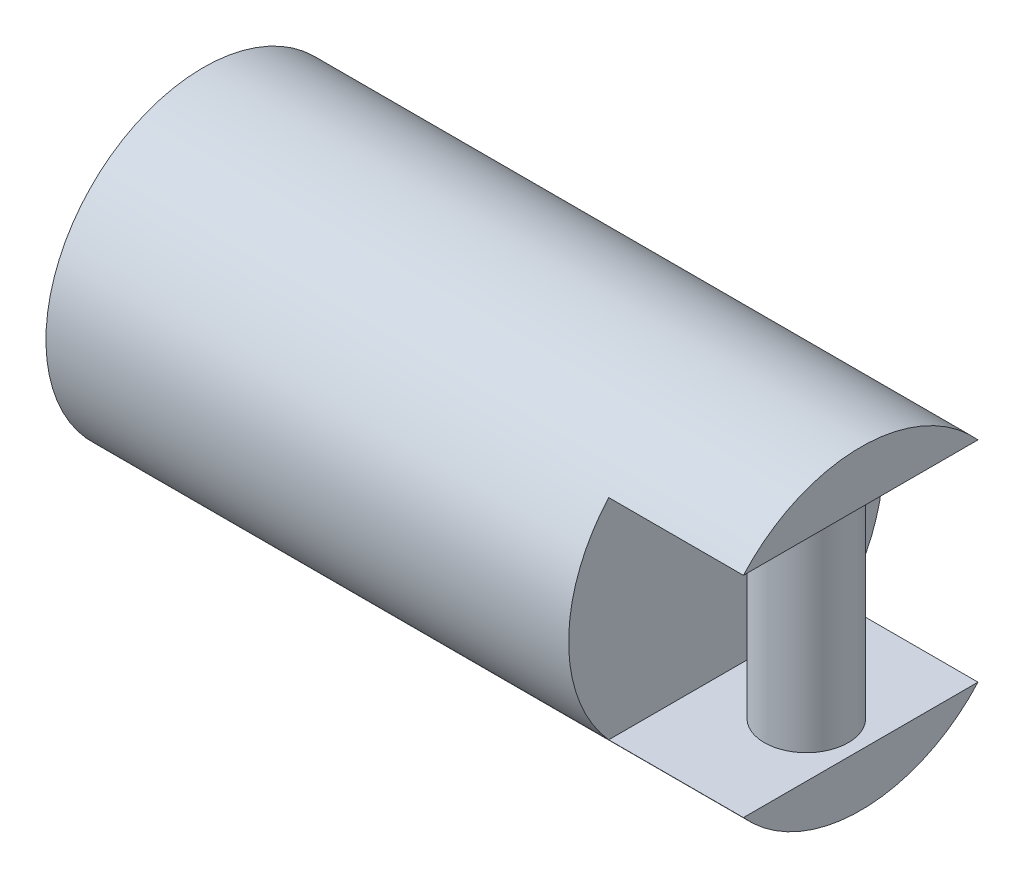
ISO-10303-21;
HEADER;
FILE_DESCRIPTION(('STEP AP214'),'2;1');
FILE_NAME('part.step','',(''),(''),'','','');
FILE_SCHEMA(('AUTOMOTIVE_DESIGN { 1 0 10303 214 1 1 1 1 }'));
ENDSEC;
DATA;
#1=APPLICATION_CONTEXT('core data for automotive mechanical design processes');
#2=APPLICATION_PROTOCOL_DEFINITION('international standard','automotive_design',2000,#1);
#3=PRODUCT_CONTEXT('',#1,'mechanical');
#4=PRODUCT('Part','Part','',(#3));
#5=PRODUCT_RELATED_PRODUCT_CATEGORY('part','',(#4));
#6=PRODUCT_DEFINITION_FORMATION('','',#4);
#7=PRODUCT_DEFINITION_CONTEXT('part definition',#1,'design');
#8=PRODUCT_DEFINITION('design','',#6,#7);
#9=PRODUCT_DEFINITION_SHAPE('','',#8);
#10=(LENGTH_UNIT() NAMED_UNIT(*) SI_UNIT(.MILLI.,.METRE.));
#11=(NAMED_UNIT(*) PLANE_ANGLE_UNIT() SI_UNIT($,.RADIAN.));
#12=(NAMED_UNIT(*) SI_UNIT($,.STERADIAN.) SOLID_ANGLE_UNIT());
#13=UNCERTAINTY_MEASURE_WITH_UNIT(LENGTH_MEASURE(1.E-05),#10,'distance_accuracy_value','');
#14=(GEOMETRIC_REPRESENTATION_CONTEXT(3) GLOBAL_UNCERTAINTY_ASSIGNED_CONTEXT((#13)) GLOBAL_UNIT_ASSIGNED_CONTEXT((#10,
#11,#12)) REPRESENTATION_CONTEXT('',''));
#15=CARTESIAN_POINT('',(0.,0.,0.));
#16=DIRECTION('',(0.,0.,1.));
#17=DIRECTION('',(1.,0.,0.));
#18=AXIS2_PLACEMENT_3D('',#15,#16,#17);
#19=CARTESIAN_POINT('',(94.,0.,0.));
#20=DIRECTION('',(1.,0.,0.));
#21=DIRECTION('',(0.,0.,-1.));
#22=AXIS2_PLACEMENT_3D('',#19,#20,#21);
#23=PLANE('',#22);
#24=CARTESIAN_POINT('',(94.,0.,0.));
#25=DIRECTION('',(1.,0.,0.));
#26=DIRECTION('',(0.,0.,-1.));
#27=AXIS2_PLACEMENT_3D('',#24,#25,#26);
#28=CIRCLE('',#27,22.5);
#29=CARTESIAN_POINT('',(94.,15.,-16.7705098312484));
#30=VERTEX_POINT('',#29);
#31=CARTESIAN_POINT('',(94.,15.,16.7705098312484));
#32=VERTEX_POINT('',#31);
#33=EDGE_CURVE('E90',#30,#32,#28,.T.);
#34=ORIENTED_EDGE('',*,*,#33,.T.);
#35=DIRECTION('',(0.,0.,-1.));
#36=VECTOR('',#35,1.);
#37=CARTESIAN_POINT('',(94.,15.,0.));
#38=LINE('',#37,#36);
#39=EDGE_CURVE('E81',#32,#30,#38,.T.);
#40=ORIENTED_EDGE('',*,*,#39,.T.);
#41=EDGE_LOOP('',(#34,#40));
#42=FACE_BOUND('',#41,.T.);
#43=ADVANCED_FACE('F41',(#42),#23,.T.);
#44=CARTESIAN_POINT('',(94.,0.,0.));
#45=DIRECTION('',(-1.,0.,0.));
#46=DIRECTION('',(0.,0.,1.));
#47=AXIS2_PLACEMENT_3D('',#44,#45,#46);
#48=CYLINDRICAL_SURFACE('',#47,22.5);
#49=CARTESIAN_POINT('',(94.,-15.,16.7705098312484));
#50=VERTEX_POINT('',#49);
#51=CARTESIAN_POINT('',(94.,-15.,-16.7705098312484));
#52=VERTEX_POINT('',#51);
#53=EDGE_CURVE('E101',#50,#52,#28,.T.);
#54=ORIENTED_EDGE('',*,*,#53,.F.);
#55=DIRECTION('',(-1.,0.,0.));
#56=VECTOR('',#55,1.);
#57=CARTESIAN_POINT('',(94.,-15.,16.7705098312484));
#58=LINE('',#57,#56);
#59=CARTESIAN_POINT('',(74.7368682808615,-15.,16.7705098312484));
#60=VERTEX_POINT('',#59);
#61=EDGE_CURVE('E108',#50,#60,#58,.T.);
#62=ORIENTED_EDGE('',*,*,#61,.T.);
#63=CARTESIAN_POINT('',(74.7368682808615,0.,0.));
#64=DIRECTION('',(-1.,0.,0.));
#65=DIRECTION('',(0.,0.,1.));
#66=AXIS2_PLACEMENT_3D('',#63,#64,#65);
#67=CIRCLE('',#66,22.5);
#68=CARTESIAN_POINT('',(74.7368682808615,15.,16.7705098312484));
#69=VERTEX_POINT('',#68);
#70=EDGE_CURVE('E50',#60,#69,#67,.T.);
#71=ORIENTED_EDGE('',*,*,#70,.T.);
#72=DIRECTION('',(-1.,0.,0.));
#73=VECTOR('',#72,1.);
#74=CARTESIAN_POINT('',(94.,15.,16.7705098312484));
#75=LINE('',#74,#73);
#76=EDGE_CURVE('E84',#32,#69,#75,.T.);
#77=ORIENTED_EDGE('',*,*,#76,.F.);
#78=ORIENTED_EDGE('',*,*,#33,.F.);
#79=DIRECTION('',(-1.,0.,0.));
#80=VECTOR('',#79,1.);
#81=CARTESIAN_POINT('',(94.,15.,-16.7705098312484));
#82=LINE('',#81,#80);
#83=CARTESIAN_POINT('',(74.7368682808615,15.,-16.7705098312484));
#84=VERTEX_POINT('',#83);
#85=EDGE_CURVE('E57',#84,#30,#82,.F.);
#86=ORIENTED_EDGE('',*,*,#85,.F.);
#87=CARTESIAN_POINT('',(74.7368682808615,-15.,-16.7705098312484));
#88=VERTEX_POINT('',#87);
#89=EDGE_CURVE('E114',#84,#88,#67,.T.);
#90=ORIENTED_EDGE('',*,*,#89,.T.);
#91=DIRECTION('',(-1.,0.,0.));
#92=VECTOR('',#91,1.);
#93=CARTESIAN_POINT('',(94.,-15.,-16.7705098312484));
#94=LINE('',#93,#92);
#95=EDGE_CURVE('E98',#88,#52,#94,.F.);
#96=ORIENTED_EDGE('',*,*,#95,.T.);
#97=EDGE_LOOP('',(#54,#62,#71,#77,#78,#86,#90,#96));
#98=FACE_BOUND('',#97,.T.);
#99=CARTESIAN_POINT('',(0.,0.,0.));
#100=DIRECTION('',(1.,0.,0.));
#101=DIRECTION('',(0.,0.,-1.));
#102=AXIS2_PLACEMENT_3D('',#99,#100,#101);
#103=CIRCLE('',#102,22.5);
#104=CARTESIAN_POINT('',(0.,0.,-22.5));
#105=VERTEX_POINT('',#104);
#106=EDGE_CURVE('E105',#105,#105,#103,.T.);
#107=ORIENTED_EDGE('',*,*,#106,.T.);
#108=EDGE_LOOP('',(#107));
#109=FACE_BOUND('',#108,.T.);
#110=ADVANCED_FACE('F43',(#98,#109),#48,.T.);
#111=DIRECTION('',(0.,0.,-1.));
#112=VECTOR('',#111,1.);
#113=CARTESIAN_POINT('',(94.,-15.,0.));
#114=LINE('',#113,#112);
#115=EDGE_CURVE('E65',#50,#52,#114,.T.);
#116=ORIENTED_EDGE('',*,*,#115,.F.);
#117=ORIENTED_EDGE('',*,*,#53,.T.);
#118=EDGE_LOOP('',(#116,#117));
#119=FACE_BOUND('',#118,.T.);
#120=ADVANCED_FACE('F138',(#119),#23,.T.);
#121=CARTESIAN_POINT('',(0.,0.,0.));
#122=DIRECTION('',(1.,0.,0.));
#123=DIRECTION('',(0.,0.,-1.));
#124=AXIS2_PLACEMENT_3D('',#121,#122,#123);
#125=PLANE('',#124);
#126=ORIENTED_EDGE('',*,*,#106,.F.);
#127=EDGE_LOOP('',(#126));
#128=FACE_BOUND('',#127,.T.);
#129=ADVANCED_FACE('F140',(#128),#125,.F.);
#130=CARTESIAN_POINT('',(74.7368682808615,0.,53.));
#131=DIRECTION('',(-1.,0.,0.));
#132=DIRECTION('',(0.,0.,1.));
#133=AXIS2_PLACEMENT_3D('',#130,#131,#132);
#134=PLANE('',#133);
#135=DIRECTION('',(0.,0.,-1.));
#136=VECTOR('',#135,1.);
#137=CARTESIAN_POINT('',(74.7368682808615,15.,53.));
#138=LINE('',#137,#136);
#139=EDGE_CURVE('E121',#69,#84,#138,.T.);
#140=ORIENTED_EDGE('',*,*,#139,.F.);
#141=ORIENTED_EDGE('',*,*,#70,.F.);
#142=DIRECTION('',(0.,0.,-1.));
#143=VECTOR('',#142,1.);
#144=CARTESIAN_POINT('',(74.7368682808615,-15.,53.));
#145=LINE('',#144,#143);
#146=EDGE_CURVE('E123',#60,#88,#145,.T.);
#147=ORIENTED_EDGE('',*,*,#146,.T.);
#148=ORIENTED_EDGE('',*,*,#89,.F.);
#149=EDGE_LOOP('',(#140,#141,#147,#148));
#150=FACE_BOUND('',#149,.T.);
#151=ADVANCED_FACE('F120',(#150),#134,.F.);
#152=CARTESIAN_POINT('',(0.,-15.,53.));
#153=DIRECTION('',(0.,-1.,0.));
#154=DIRECTION('',(1.,0.,0.));
#155=AXIS2_PLACEMENT_3D('',#152,#153,#154);
#156=PLANE('',#155);
#157=CARTESIAN_POINT('',(86.2244177625488,-15.,0.));
#158=DIRECTION('',(0.,-1.,0.));
#159=DIRECTION('',(1.,0.,0.));
#160=AXIS2_PLACEMENT_3D('',#157,#158,#159);
#161=CIRCLE('',#160,6.);
#162=CARTESIAN_POINT('',(92.2244177625488,-15.,0.));
#163=VERTEX_POINT('',#162);
#164=EDGE_CURVE('E125',#163,#163,#161,.T.);
#165=ORIENTED_EDGE('',*,*,#164,.T.);
#166=EDGE_LOOP('',(#165));
#167=FACE_BOUND('',#166,.T.);
#168=ORIENTED_EDGE('',*,*,#115,.T.);
#169=ORIENTED_EDGE('',*,*,#95,.F.);
#170=ORIENTED_EDGE('',*,*,#146,.F.);
#171=ORIENTED_EDGE('',*,*,#61,.F.);
#172=EDGE_LOOP('',(#168,#169,#170,#171));
#173=FACE_BOUND('',#172,.T.);
#174=ADVANCED_FACE('F136',(#167,#173),#156,.F.);
#175=CARTESIAN_POINT('',(0.,15.,53.));
#176=DIRECTION('',(0.,-1.,0.));
#177=DIRECTION('',(1.,0.,0.));
#178=AXIS2_PLACEMENT_3D('',#175,#176,#177);
#179=PLANE('',#178);
#180=CARTESIAN_POINT('',(86.2244177625488,15.,0.));
#181=DIRECTION('',(0.,-1.,0.));
#182=DIRECTION('',(1.,0.,0.));
#183=AXIS2_PLACEMENT_3D('',#180,#181,#182);
#184=CIRCLE('',#183,6.);
#185=CARTESIAN_POINT('',(92.2244177625488,15.,0.));
#186=VERTEX_POINT('',#185);
#187=EDGE_CURVE('E11',#186,#186,#184,.T.);
#188=ORIENTED_EDGE('',*,*,#187,.F.);
#189=EDGE_LOOP('',(#188));
#190=FACE_BOUND('',#189,.T.);
#191=ORIENTED_EDGE('',*,*,#76,.T.);
#192=ORIENTED_EDGE('',*,*,#139,.T.);
#193=ORIENTED_EDGE('',*,*,#85,.T.);
#194=ORIENTED_EDGE('',*,*,#39,.F.);
#195=EDGE_LOOP('',(#191,#192,#193,#194));
#196=FACE_BOUND('',#195,.T.);
#197=ADVANCED_FACE('F83',(#190,#196),#179,.T.);
#198=CARTESIAN_POINT('',(86.2244177625488,-19.,0.));
#199=DIRECTION('',(0.,1.,0.));
#200=DIRECTION('',(0.,0.,1.));
#201=AXIS2_PLACEMENT_3D('',#198,#199,#200);
#202=CYLINDRICAL_SURFACE('',#201,6.);
#203=ORIENTED_EDGE('',*,*,#187,.T.);
#204=EDGE_LOOP('',(#203));
#205=FACE_BOUND('',#204,.T.);
#206=ORIENTED_EDGE('',*,*,#164,.F.);
#207=EDGE_LOOP('',(#206));
#208=FACE_BOUND('',#207,.T.);
#209=ADVANCED_FACE('F187',(#205,#208),#202,.T.);
#210=CLOSED_SHELL('',(#43,#110,#120,#129,#151,#174,#197,#209));
#211=MANIFOLD_SOLID_BREP('B2',#210);
#212=ADVANCED_BREP_SHAPE_REPRESENTATION('',(#18,#211),#14);
#213=SHAPE_DEFINITION_REPRESENTATION(#9,#212);
ENDSEC;
END-ISO-10303-21;
